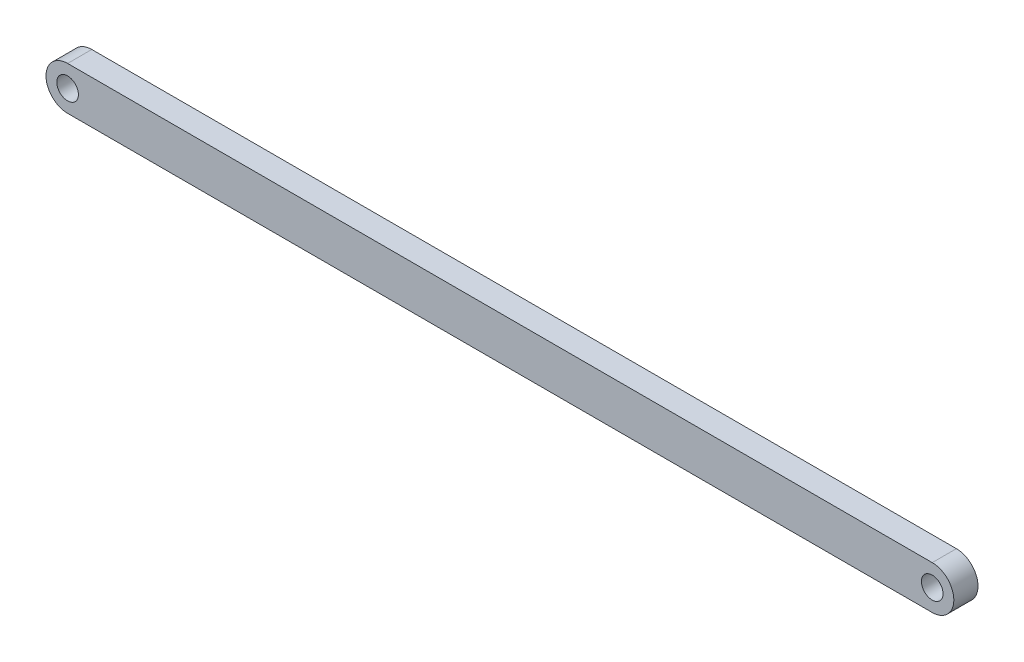
ISO-10303-21;
HEADER;
FILE_DESCRIPTION(('STEP AP214'),'2;1');
FILE_NAME('part.step','',(''),(''),'','','');
FILE_SCHEMA(('AUTOMOTIVE_DESIGN { 1 0 10303 214 1 1 1 1 }'));
ENDSEC;
DATA;
#1=APPLICATION_CONTEXT('core data for automotive mechanical design processes');
#2=APPLICATION_PROTOCOL_DEFINITION('international standard','automotive_design',2000,#1);
#3=PRODUCT_CONTEXT('',#1,'mechanical');
#4=PRODUCT('Part','Part','',(#3));
#5=PRODUCT_RELATED_PRODUCT_CATEGORY('part','',(#4));
#6=PRODUCT_DEFINITION_FORMATION('','',#4);
#7=PRODUCT_DEFINITION_CONTEXT('part definition',#1,'design');
#8=PRODUCT_DEFINITION('design','',#6,#7);
#9=PRODUCT_DEFINITION_SHAPE('','',#8);
#10=(LENGTH_UNIT() NAMED_UNIT(*) SI_UNIT(.MILLI.,.METRE.));
#11=(NAMED_UNIT(*) PLANE_ANGLE_UNIT() SI_UNIT($,.RADIAN.));
#12=(NAMED_UNIT(*) SI_UNIT($,.STERADIAN.) SOLID_ANGLE_UNIT());
#13=UNCERTAINTY_MEASURE_WITH_UNIT(LENGTH_MEASURE(1.E-05),#10,'distance_accuracy_value','');
#14=(GEOMETRIC_REPRESENTATION_CONTEXT(3) GLOBAL_UNCERTAINTY_ASSIGNED_CONTEXT((#13)) GLOBAL_UNIT_ASSIGNED_CONTEXT((#10,
#11,#12)) REPRESENTATION_CONTEXT('',''));
#15=CARTESIAN_POINT('',(0.,0.,0.));
#16=DIRECTION('',(0.,0.,1.));
#17=DIRECTION('',(1.,0.,0.));
#18=AXIS2_PLACEMENT_3D('',#15,#16,#17);
#19=CARTESIAN_POINT('',(-50.8,0.,-1.42));
#20=DIRECTION('',(0.,0.,1.));
#21=DIRECTION('',(1.,0.,0.));
#22=AXIS2_PLACEMENT_3D('',#19,#20,#21);
#23=CYLINDRICAL_SURFACE('',#22,2.54000000000001);
#24=DIRECTION('',(0.,0.,1.));
#25=VECTOR('',#24,1.);
#26=CARTESIAN_POINT('',(-50.8,-2.54000000000001,-1.42));
#27=LINE('',#26,#25);
#28=CARTESIAN_POINT('',(-50.8,-2.54000000000001,-1.42));
#29=VERTEX_POINT('',#28);
#30=CARTESIAN_POINT('',(-50.8,-2.54000000000001,1.42));
#31=VERTEX_POINT('',#30);
#32=EDGE_CURVE('E36',#29,#31,#27,.T.);
#33=ORIENTED_EDGE('',*,*,#32,.T.);
#34=CARTESIAN_POINT('',(-50.8,0.,1.42));
#35=DIRECTION('',(0.,0.,1.));
#36=DIRECTION('',(1.,0.,0.));
#37=AXIS2_PLACEMENT_3D('',#34,#35,#36);
#38=CIRCLE('',#37,2.54000000000001);
#39=CARTESIAN_POINT('',(-50.8,2.54000000000001,1.42));
#40=VERTEX_POINT('',#39);
#41=EDGE_CURVE('E73',#40,#31,#38,.T.);
#42=ORIENTED_EDGE('',*,*,#41,.F.);
#43=DIRECTION('',(0.,0.,1.));
#44=VECTOR('',#43,1.);
#45=CARTESIAN_POINT('',(-50.8,2.54000000000001,-1.42));
#46=LINE('',#45,#44);
#47=CARTESIAN_POINT('',(-50.8,2.54000000000001,-1.42));
#48=VERTEX_POINT('',#47);
#49=EDGE_CURVE('E11',#48,#40,#46,.T.);
#50=ORIENTED_EDGE('',*,*,#49,.F.);
#51=CARTESIAN_POINT('',(-50.8,0.,-1.42));
#52=DIRECTION('',(0.,0.,1.));
#53=DIRECTION('',(1.,0.,0.));
#54=AXIS2_PLACEMENT_3D('',#51,#52,#53);
#55=CIRCLE('',#54,2.54000000000001);
#56=EDGE_CURVE('E74',#48,#29,#55,.T.);
#57=ORIENTED_EDGE('',*,*,#56,.T.);
#58=EDGE_LOOP('',(#33,#42,#50,#57));
#59=FACE_BOUND('',#58,.T.);
#60=ADVANCED_FACE('F33',(#59),#23,.T.);
#61=CARTESIAN_POINT('',(-50.8,2.54000000000001,-1.42));
#62=DIRECTION('',(0.,1.,0.));
#63=DIRECTION('',(0.,0.,1.));
#64=AXIS2_PLACEMENT_3D('',#61,#62,#63);
#65=PLANE('',#64);
#66=ORIENTED_EDGE('',*,*,#49,.T.);
#67=DIRECTION('',(-1.,0.,0.));
#68=VECTOR('',#67,1.);
#69=CARTESIAN_POINT('',(-50.8,2.54000000000001,1.42));
#70=LINE('',#69,#68);
#71=CARTESIAN_POINT('',(50.8,2.54000000000001,1.42));
#72=VERTEX_POINT('',#71);
#73=EDGE_CURVE('E91',#72,#40,#70,.T.);
#74=ORIENTED_EDGE('',*,*,#73,.F.);
#75=DIRECTION('',(0.,0.,1.));
#76=VECTOR('',#75,1.);
#77=CARTESIAN_POINT('',(50.8,2.54000000000001,-1.42));
#78=LINE('',#77,#76);
#79=CARTESIAN_POINT('',(50.8,2.54000000000001,-1.42));
#80=VERTEX_POINT('',#79);
#81=EDGE_CURVE('E41',#80,#72,#78,.T.);
#82=ORIENTED_EDGE('',*,*,#81,.F.);
#83=DIRECTION('',(-1.,0.,0.));
#84=VECTOR('',#83,1.);
#85=CARTESIAN_POINT('',(-50.8,2.54000000000001,-1.42));
#86=LINE('',#85,#84);
#87=EDGE_CURVE('E79',#80,#48,#86,.T.);
#88=ORIENTED_EDGE('',*,*,#87,.T.);
#89=EDGE_LOOP('',(#66,#74,#82,#88));
#90=FACE_BOUND('',#89,.T.);
#91=ADVANCED_FACE('F117',(#90),#65,.T.);
#92=CARTESIAN_POINT('',(50.8,0.,-1.42));
#93=DIRECTION('',(0.,0.,1.));
#94=DIRECTION('',(1.,0.,0.));
#95=AXIS2_PLACEMENT_3D('',#92,#93,#94);
#96=CYLINDRICAL_SURFACE('',#95,2.54000000000001);
#97=ORIENTED_EDGE('',*,*,#81,.T.);
#98=CARTESIAN_POINT('',(50.8,0.,1.42));
#99=DIRECTION('',(0.,0.,1.));
#100=DIRECTION('',(1.,0.,0.));
#101=AXIS2_PLACEMENT_3D('',#98,#99,#100);
#102=CIRCLE('',#101,2.54000000000001);
#103=CARTESIAN_POINT('',(50.8,-2.54000000000002,1.42));
#104=VERTEX_POINT('',#103);
#105=EDGE_CURVE('E86',#104,#72,#102,.T.);
#106=ORIENTED_EDGE('',*,*,#105,.F.);
#107=DIRECTION('',(0.,0.,1.));
#108=VECTOR('',#107,1.);
#109=CARTESIAN_POINT('',(50.8,-2.54000000000002,-1.42));
#110=LINE('',#109,#108);
#111=CARTESIAN_POINT('',(50.8,-2.54000000000002,-1.42));
#112=VERTEX_POINT('',#111);
#113=EDGE_CURVE('E78',#112,#104,#110,.T.);
#114=ORIENTED_EDGE('',*,*,#113,.F.);
#115=CARTESIAN_POINT('',(50.8,0.,-1.42));
#116=DIRECTION('',(0.,0.,1.));
#117=DIRECTION('',(1.,0.,0.));
#118=AXIS2_PLACEMENT_3D('',#115,#116,#117);
#119=CIRCLE('',#118,2.54000000000001);
#120=EDGE_CURVE('E110',#112,#80,#119,.T.);
#121=ORIENTED_EDGE('',*,*,#120,.T.);
#122=EDGE_LOOP('',(#97,#106,#114,#121));
#123=FACE_BOUND('',#122,.T.);
#124=ADVANCED_FACE('F114',(#123),#96,.T.);
#125=CARTESIAN_POINT('',(-50.8,-2.54000000000001,-1.42));
#126=DIRECTION('',(0.,-1.,0.));
#127=DIRECTION('',(0.,0.,-1.));
#128=AXIS2_PLACEMENT_3D('',#125,#126,#127);
#129=PLANE('',#128);
#130=ORIENTED_EDGE('',*,*,#113,.T.);
#131=DIRECTION('',(1.,0.,0.));
#132=VECTOR('',#131,1.);
#133=CARTESIAN_POINT('',(-50.8,-2.54000000000001,1.42));
#134=LINE('',#133,#132);
#135=EDGE_CURVE('E81',#31,#104,#134,.T.);
#136=ORIENTED_EDGE('',*,*,#135,.F.);
#137=ORIENTED_EDGE('',*,*,#32,.F.);
#138=DIRECTION('',(1.,0.,0.));
#139=VECTOR('',#138,1.);
#140=CARTESIAN_POINT('',(-50.8,-2.54000000000001,-1.42));
#141=LINE('',#140,#139);
#142=EDGE_CURVE('E108',#29,#112,#141,.T.);
#143=ORIENTED_EDGE('',*,*,#142,.T.);
#144=EDGE_LOOP('',(#130,#136,#137,#143));
#145=FACE_BOUND('',#144,.T.);
#146=ADVANCED_FACE('F82',(#145),#129,.T.);
#147=CARTESIAN_POINT('',(-50.8,0.,-1.42));
#148=DIRECTION('',(0.,0.,1.));
#149=DIRECTION('',(1.,0.,0.));
#150=AXIS2_PLACEMENT_3D('',#147,#148,#149);
#151=PLANE('',#150);
#152=CARTESIAN_POINT('',(50.8,0.,-1.42));
#153=DIRECTION('',(0.,0.,1.));
#154=DIRECTION('',(1.,0.,0.));
#155=AXIS2_PLACEMENT_3D('',#152,#153,#154);
#156=CIRCLE('',#155,1.26999999999999);
#157=CARTESIAN_POINT('',(52.07,0.,-1.42));
#158=VERTEX_POINT('',#157);
#159=EDGE_CURVE('E101',#158,#158,#156,.T.);
#160=ORIENTED_EDGE('',*,*,#159,.T.);
#161=EDGE_LOOP('',(#160));
#162=FACE_BOUND('',#161,.T.);
#163=CARTESIAN_POINT('',(-50.8,0.,-1.42));
#164=DIRECTION('',(0.,0.,1.));
#165=DIRECTION('',(1.,0.,0.));
#166=AXIS2_PLACEMENT_3D('',#163,#164,#165);
#167=CIRCLE('',#166,1.27);
#168=CARTESIAN_POINT('',(-49.53,0.,-1.42));
#169=VERTEX_POINT('',#168);
#170=EDGE_CURVE('E104',#169,#169,#167,.T.);
#171=ORIENTED_EDGE('',*,*,#170,.T.);
#172=EDGE_LOOP('',(#171));
#173=FACE_BOUND('',#172,.T.);
#174=ORIENTED_EDGE('',*,*,#56,.F.);
#175=ORIENTED_EDGE('',*,*,#87,.F.);
#176=ORIENTED_EDGE('',*,*,#120,.F.);
#177=ORIENTED_EDGE('',*,*,#142,.F.);
#178=EDGE_LOOP('',(#174,#175,#176,#177));
#179=FACE_BOUND('',#178,.T.);
#180=ADVANCED_FACE('F119',(#162,#173,#179),#151,.F.);
#181=CARTESIAN_POINT('',(-50.8,0.,-1.42));
#182=DIRECTION('',(0.,0.,1.));
#183=DIRECTION('',(1.,0.,0.));
#184=AXIS2_PLACEMENT_3D('',#181,#182,#183);
#185=CYLINDRICAL_SURFACE('',#184,1.27);
#186=ORIENTED_EDGE('',*,*,#170,.F.);
#187=EDGE_LOOP('',(#186));
#188=FACE_BOUND('',#187,.T.);
#189=CARTESIAN_POINT('',(-50.8,0.,1.42));
#190=DIRECTION('',(0.,0.,1.));
#191=DIRECTION('',(1.,0.,0.));
#192=AXIS2_PLACEMENT_3D('',#189,#190,#191);
#193=CIRCLE('',#192,1.27);
#194=CARTESIAN_POINT('',(-49.53,0.,1.42));
#195=VERTEX_POINT('',#194);
#196=EDGE_CURVE('E92',#195,#195,#193,.T.);
#197=ORIENTED_EDGE('',*,*,#196,.T.);
#198=EDGE_LOOP('',(#197));
#199=FACE_BOUND('',#198,.T.);
#200=ADVANCED_FACE('F121',(#188,#199),#185,.F.);
#201=CARTESIAN_POINT('',(50.8,0.,-1.42));
#202=DIRECTION('',(0.,0.,1.));
#203=DIRECTION('',(1.,0.,0.));
#204=AXIS2_PLACEMENT_3D('',#201,#202,#203);
#205=CYLINDRICAL_SURFACE('',#204,1.26999999999999);
#206=ORIENTED_EDGE('',*,*,#159,.F.);
#207=EDGE_LOOP('',(#206));
#208=FACE_BOUND('',#207,.T.);
#209=CARTESIAN_POINT('',(50.8,0.,1.42));
#210=DIRECTION('',(0.,0.,1.));
#211=DIRECTION('',(1.,0.,0.));
#212=AXIS2_PLACEMENT_3D('',#209,#210,#211);
#213=CIRCLE('',#212,1.26999999999999);
#214=CARTESIAN_POINT('',(52.07,0.,1.42));
#215=VERTEX_POINT('',#214);
#216=EDGE_CURVE('E95',#215,#215,#213,.T.);
#217=ORIENTED_EDGE('',*,*,#216,.T.);
#218=EDGE_LOOP('',(#217));
#219=FACE_BOUND('',#218,.T.);
#220=ADVANCED_FACE('F128',(#208,#219),#205,.F.);
#221=CARTESIAN_POINT('',(-50.8,0.,1.42));
#222=DIRECTION('',(0.,0.,1.));
#223=DIRECTION('',(1.,0.,0.));
#224=AXIS2_PLACEMENT_3D('',#221,#222,#223);
#225=PLANE('',#224);
#226=ORIENTED_EDGE('',*,*,#196,.F.);
#227=EDGE_LOOP('',(#226));
#228=FACE_BOUND('',#227,.T.);
#229=ORIENTED_EDGE('',*,*,#41,.T.);
#230=ORIENTED_EDGE('',*,*,#135,.T.);
#231=ORIENTED_EDGE('',*,*,#105,.T.);
#232=ORIENTED_EDGE('',*,*,#73,.T.);
#233=EDGE_LOOP('',(#229,#230,#231,#232));
#234=FACE_BOUND('',#233,.T.);
#235=ORIENTED_EDGE('',*,*,#216,.F.);
#236=EDGE_LOOP('',(#235));
#237=FACE_BOUND('',#236,.T.);
#238=ADVANCED_FACE('F89',(#228,#234,#237),#225,.T.);
#239=CLOSED_SHELL('',(#60,#91,#124,#146,#180,#200,#220,#238));
#240=MANIFOLD_SOLID_BREP('B2',#239);
#241=ADVANCED_BREP_SHAPE_REPRESENTATION('',(#18,#240),#14);
#242=SHAPE_DEFINITION_REPRESENTATION(#9,#241);
ENDSEC;
END-ISO-10303-21;
